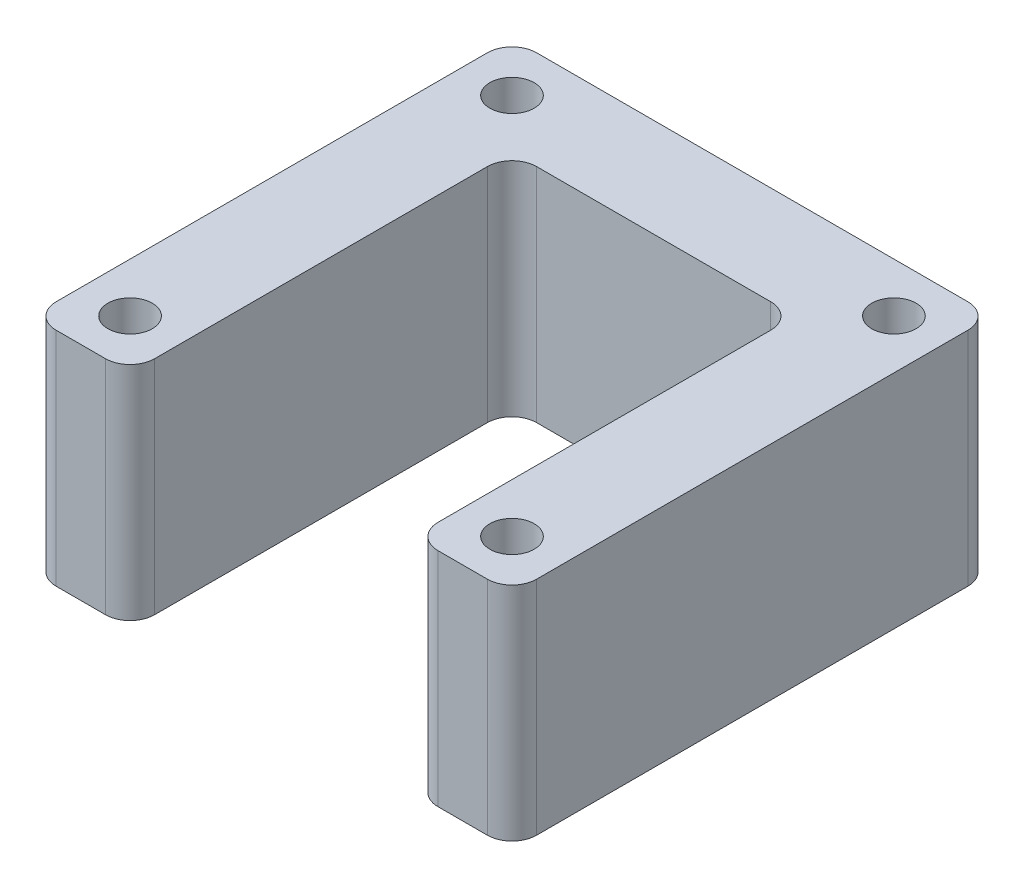
ISO-10303-21;
HEADER;
FILE_DESCRIPTION(('STEP AP214'),'2;1');
FILE_NAME('part.step','',(''),(''),'','','');
FILE_SCHEMA(('AUTOMOTIVE_DESIGN { 1 0 10303 214 1 1 1 1 }'));
ENDSEC;
DATA;
#1=APPLICATION_CONTEXT('core data for automotive mechanical design processes');
#2=APPLICATION_PROTOCOL_DEFINITION('international standard','automotive_design',2000,#1);
#3=PRODUCT_CONTEXT('',#1,'mechanical');
#4=PRODUCT('Part','Part','',(#3));
#5=PRODUCT_RELATED_PRODUCT_CATEGORY('part','',(#4));
#6=PRODUCT_DEFINITION_FORMATION('','',#4);
#7=PRODUCT_DEFINITION_CONTEXT('part definition',#1,'design');
#8=PRODUCT_DEFINITION('design','',#6,#7);
#9=PRODUCT_DEFINITION_SHAPE('','',#8);
#10=(LENGTH_UNIT() NAMED_UNIT(*) SI_UNIT(.MILLI.,.METRE.));
#11=(NAMED_UNIT(*) PLANE_ANGLE_UNIT() SI_UNIT($,.RADIAN.));
#12=(NAMED_UNIT(*) SI_UNIT($,.STERADIAN.) SOLID_ANGLE_UNIT());
#13=UNCERTAINTY_MEASURE_WITH_UNIT(LENGTH_MEASURE(1.E-05),#10,'distance_accuracy_value','');
#14=(GEOMETRIC_REPRESENTATION_CONTEXT(3) GLOBAL_UNCERTAINTY_ASSIGNED_CONTEXT((#13)) GLOBAL_UNIT_ASSIGNED_CONTEXT((#10,
#11,#12)) REPRESENTATION_CONTEXT('',''));
#15=CARTESIAN_POINT('',(0.,0.,0.));
#16=DIRECTION('',(0.,0.,1.));
#17=DIRECTION('',(1.,0.,0.));
#18=AXIS2_PLACEMENT_3D('',#15,#16,#17);
#19=CARTESIAN_POINT('',(-15.6073619631902,18.,0.));
#20=DIRECTION('',(1.,0.,0.));
#21=DIRECTION('',(0.,0.,-1.));
#22=AXIS2_PLACEMENT_3D('',#19,#20,#21);
#23=PLANE('',#22);
#24=DIRECTION('',(0.,0.,1.));
#25=VECTOR('',#24,1.);
#26=CARTESIAN_POINT('',(-15.6073619631902,18.,0.));
#27=LINE('',#26,#25);
#28=CARTESIAN_POINT('',(-15.6073619631902,18.,-21.2628834355828));
#29=VERTEX_POINT('',#28);
#30=CARTESIAN_POINT('',(-15.6073619631902,18.,13.7371165644172));
#31=VERTEX_POINT('',#30);
#32=EDGE_CURVE('E172',#29,#31,#27,.T.);
#33=ORIENTED_EDGE('',*,*,#32,.F.);
#34=DIRECTION('',(0.,-1.,0.));
#35=VECTOR('',#34,1.);
#36=CARTESIAN_POINT('',(-15.6073619631902,0.,-21.2628834355828));
#37=LINE('',#36,#35);
#38=CARTESIAN_POINT('',(-15.6073619631902,0.,-21.2628834355828));
#39=VERTEX_POINT('',#38);
#40=EDGE_CURVE('E157',#29,#39,#37,.T.);
#41=ORIENTED_EDGE('',*,*,#40,.T.);
#42=DIRECTION('',(0.,0.,1.));
#43=VECTOR('',#42,1.);
#44=CARTESIAN_POINT('',(-15.6073619631902,0.,0.));
#45=LINE('',#44,#43);
#46=CARTESIAN_POINT('',(-15.6073619631902,0.,13.7371165644172));
#47=VERTEX_POINT('',#46);
#48=EDGE_CURVE('E169',#39,#47,#45,.T.);
#49=ORIENTED_EDGE('',*,*,#48,.T.);
#50=DIRECTION('',(0.,-1.,0.));
#51=VECTOR('',#50,1.);
#52=CARTESIAN_POINT('',(-15.6073619631902,18.,13.7371165644172));
#53=LINE('',#52,#51);
#54=EDGE_CURVE('E174',#47,#31,#53,.F.);
#55=ORIENTED_EDGE('',*,*,#54,.T.);
#56=EDGE_LOOP('',(#33,#41,#49,#55));
#57=FACE_BOUND('',#56,.T.);
#58=ADVANCED_FACE('F39',(#57),#23,.F.);
#59=CARTESIAN_POINT('',(0.,18.,15.7371165644172));
#60=DIRECTION('',(0.,0.,-1.));
#61=DIRECTION('',(-1.,0.,0.));
#62=AXIS2_PLACEMENT_3D('',#59,#60,#61);
#63=PLANE('',#62);
#64=DIRECTION('',(1.,0.,0.));
#65=VECTOR('',#64,1.);
#66=CARTESIAN_POINT('',(0.,18.,15.7371165644172));
#67=LINE('',#66,#65);
#68=CARTESIAN_POINT('',(-13.6073619631902,18.,15.7371165644172));
#69=VERTEX_POINT('',#68);
#70=CARTESIAN_POINT('',(-9.60736196319018,18.,15.7371165644172));
#71=VERTEX_POINT('',#70);
#72=EDGE_CURVE('E371',#69,#71,#67,.T.);
#73=ORIENTED_EDGE('',*,*,#72,.F.);
#74=DIRECTION('',(0.,-1.,0.));
#75=VECTOR('',#74,1.);
#76=CARTESIAN_POINT('',(-13.6073619631902,18.,15.7371165644172));
#77=LINE('',#76,#75);
#78=CARTESIAN_POINT('',(-13.6073619631902,0.,15.7371165644172));
#79=VERTEX_POINT('',#78);
#80=EDGE_CURVE('E236',#69,#79,#77,.T.);
#81=ORIENTED_EDGE('',*,*,#80,.T.);
#82=DIRECTION('',(1.,0.,0.));
#83=VECTOR('',#82,1.);
#84=CARTESIAN_POINT('',(0.,0.,15.7371165644172));
#85=LINE('',#84,#83);
#86=CARTESIAN_POINT('',(-9.60736196319018,0.,15.7371165644172));
#87=VERTEX_POINT('',#86);
#88=EDGE_CURVE('E179',#79,#87,#85,.T.);
#89=ORIENTED_EDGE('',*,*,#88,.T.);
#90=DIRECTION('',(0.,-1.,0.));
#91=VECTOR('',#90,1.);
#92=CARTESIAN_POINT('',(-9.60736196319018,18.,15.7371165644172));
#93=LINE('',#92,#91);
#94=EDGE_CURVE('E234',#87,#71,#93,.F.);
#95=ORIENTED_EDGE('',*,*,#94,.T.);
#96=EDGE_LOOP('',(#73,#81,#89,#95));
#97=FACE_BOUND('',#96,.T.);
#98=ADVANCED_FACE('F324',(#97),#63,.F.);
#99=CARTESIAN_POINT('',(-7.60736196319018,18.,0.));
#100=DIRECTION('',(1.,0.,0.));
#101=DIRECTION('',(0.,0.,-1.));
#102=AXIS2_PLACEMENT_3D('',#99,#100,#101);
#103=PLANE('',#102);
#104=DIRECTION('',(0.,0.,1.));
#105=VECTOR('',#104,1.);
#106=CARTESIAN_POINT('',(-7.60736196319018,18.,0.));
#107=LINE('',#106,#105);
#108=CARTESIAN_POINT('',(-7.60736196319018,18.,-13.2628834355828));
#109=VERTEX_POINT('',#108);
#110=CARTESIAN_POINT('',(-7.60736196319018,18.,13.7371165644172));
#111=VERTEX_POINT('',#110);
#112=EDGE_CURVE('E289',#109,#111,#107,.T.);
#113=ORIENTED_EDGE('',*,*,#112,.T.);
#114=DIRECTION('',(0.,-1.,0.));
#115=VECTOR('',#114,1.);
#116=CARTESIAN_POINT('',(-7.60736196319018,0.,13.7371165644172));
#117=LINE('',#116,#115);
#118=CARTESIAN_POINT('',(-7.60736196319018,0.,13.7371165644172));
#119=VERTEX_POINT('',#118);
#120=EDGE_CURVE('E241',#111,#119,#117,.T.);
#121=ORIENTED_EDGE('',*,*,#120,.T.);
#122=DIRECTION('',(0.,0.,1.));
#123=VECTOR('',#122,1.);
#124=CARTESIAN_POINT('',(-7.60736196319018,0.,0.));
#125=LINE('',#124,#123);
#126=CARTESIAN_POINT('',(-7.60736196319018,0.,-13.2628834355828));
#127=VERTEX_POINT('',#126);
#128=EDGE_CURVE('E183',#127,#119,#125,.T.);
#129=ORIENTED_EDGE('',*,*,#128,.F.);
#130=DIRECTION('',(0.,-1.,0.));
#131=VECTOR('',#130,1.);
#132=CARTESIAN_POINT('',(-7.60736196319018,18.,-13.2628834355828));
#133=LINE('',#132,#131);
#134=EDGE_CURVE('E239',#127,#109,#133,.F.);
#135=ORIENTED_EDGE('',*,*,#134,.T.);
#136=EDGE_LOOP('',(#113,#121,#129,#135));
#137=FACE_BOUND('',#136,.T.);
#138=ADVANCED_FACE('F329',(#137),#103,.T.);
#139=CARTESIAN_POINT('',(0.,18.,-15.2628834355828));
#140=DIRECTION('',(0.,0.,1.));
#141=DIRECTION('',(1.,0.,0.));
#142=AXIS2_PLACEMENT_3D('',#139,#140,#141);
#143=PLANE('',#142);
#144=DIRECTION('',(-1.,0.,0.));
#145=VECTOR('',#144,1.);
#146=CARTESIAN_POINT('',(0.,18.,-15.2628834355828));
#147=LINE('',#146,#145);
#148=CARTESIAN_POINT('',(13.3926380368098,18.,-15.2628834355828));
#149=VERTEX_POINT('',#148);
#150=CARTESIAN_POINT('',(-5.60736196319018,18.,-15.2628834355828));
#151=VERTEX_POINT('',#150);
#152=EDGE_CURVE('E280',#149,#151,#147,.T.);
#153=ORIENTED_EDGE('',*,*,#152,.T.);
#154=DIRECTION('',(0.,-1.,0.));
#155=VECTOR('',#154,1.);
#156=CARTESIAN_POINT('',(-5.60736196319018,0.,-15.2628834355828));
#157=LINE('',#156,#155);
#158=CARTESIAN_POINT('',(-5.60736196319018,0.,-15.2628834355828));
#159=VERTEX_POINT('',#158);
#160=EDGE_CURVE('E246',#151,#159,#157,.T.);
#161=ORIENTED_EDGE('',*,*,#160,.T.);
#162=DIRECTION('',(-1.,0.,0.));
#163=VECTOR('',#162,1.);
#164=CARTESIAN_POINT('',(0.,0.,-15.2628834355828));
#165=LINE('',#164,#163);
#166=CARTESIAN_POINT('',(13.3926380368098,0.,-15.2628834355828));
#167=VERTEX_POINT('',#166);
#168=EDGE_CURVE('E192',#167,#159,#165,.T.);
#169=ORIENTED_EDGE('',*,*,#168,.F.);
#170=DIRECTION('',(0.,-1.,0.));
#171=VECTOR('',#170,1.);
#172=CARTESIAN_POINT('',(13.3926380368098,18.,-15.2628834355828));
#173=LINE('',#172,#171);
#174=EDGE_CURVE('E244',#167,#149,#173,.F.);
#175=ORIENTED_EDGE('',*,*,#174,.T.);
#176=EDGE_LOOP('',(#153,#161,#169,#175));
#177=FACE_BOUND('',#176,.T.);
#178=ADVANCED_FACE('F269',(#177),#143,.T.);
#179=CARTESIAN_POINT('',(15.3926380368098,18.,0.));
#180=DIRECTION('',(-1.,0.,0.));
#181=DIRECTION('',(0.,0.,1.));
#182=AXIS2_PLACEMENT_3D('',#179,#180,#181);
#183=PLANE('',#182);
#184=DIRECTION('',(0.,0.,-1.));
#185=VECTOR('',#184,1.);
#186=CARTESIAN_POINT('',(15.3926380368098,18.,0.));
#187=LINE('',#186,#185);
#188=CARTESIAN_POINT('',(15.3926380368098,18.,13.7371165644172));
#189=VERTEX_POINT('',#188);
#190=CARTESIAN_POINT('',(15.3926380368098,18.,-13.2628834355828));
#191=VERTEX_POINT('',#190);
#192=EDGE_CURVE('E278',#189,#191,#187,.T.);
#193=ORIENTED_EDGE('',*,*,#192,.T.);
#194=DIRECTION('',(0.,-1.,0.));
#195=VECTOR('',#194,1.);
#196=CARTESIAN_POINT('',(15.3926380368098,0.,-13.2628834355828));
#197=LINE('',#196,#195);
#198=CARTESIAN_POINT('',(15.3926380368098,0.,-13.2628834355828));
#199=VERTEX_POINT('',#198);
#200=EDGE_CURVE('E251',#191,#199,#197,.T.);
#201=ORIENTED_EDGE('',*,*,#200,.T.);
#202=DIRECTION('',(0.,0.,-1.));
#203=VECTOR('',#202,1.);
#204=CARTESIAN_POINT('',(15.3926380368098,0.,0.));
#205=LINE('',#204,#203);
#206=CARTESIAN_POINT('',(15.3926380368098,0.,13.7371165644172));
#207=VERTEX_POINT('',#206);
#208=EDGE_CURVE('E195',#207,#199,#205,.T.);
#209=ORIENTED_EDGE('',*,*,#208,.F.);
#210=DIRECTION('',(0.,-1.,0.));
#211=VECTOR('',#210,1.);
#212=CARTESIAN_POINT('',(15.3926380368098,18.,13.7371165644172));
#213=LINE('',#212,#211);
#214=EDGE_CURVE('E249',#207,#189,#213,.F.);
#215=ORIENTED_EDGE('',*,*,#214,.T.);
#216=EDGE_LOOP('',(#193,#201,#209,#215));
#217=FACE_BOUND('',#216,.T.);
#218=ADVANCED_FACE('F282',(#217),#183,.T.);
#219=CARTESIAN_POINT('',(0.,18.,15.7371165644172));
#220=DIRECTION('',(0.,0.,1.));
#221=DIRECTION('',(1.,0.,0.));
#222=AXIS2_PLACEMENT_3D('',#219,#220,#221);
#223=PLANE('',#222);
#224=DIRECTION('',(-1.,0.,0.));
#225=VECTOR('',#224,1.);
#226=CARTESIAN_POINT('',(0.,18.,15.7371165644172));
#227=LINE('',#226,#225);
#228=CARTESIAN_POINT('',(21.3926380368098,18.,15.7371165644172));
#229=VERTEX_POINT('',#228);
#230=CARTESIAN_POINT('',(17.3926380368098,18.,15.7371165644172));
#231=VERTEX_POINT('',#230);
#232=EDGE_CURVE('E284',#229,#231,#227,.T.);
#233=ORIENTED_EDGE('',*,*,#232,.T.);
#234=DIRECTION('',(0.,-1.,0.));
#235=VECTOR('',#234,1.);
#236=CARTESIAN_POINT('',(17.3926380368098,18.,15.7371165644172));
#237=LINE('',#236,#235);
#238=CARTESIAN_POINT('',(17.3926380368098,0.,15.7371165644172));
#239=VERTEX_POINT('',#238);
#240=EDGE_CURVE('E256',#231,#239,#237,.T.);
#241=ORIENTED_EDGE('',*,*,#240,.T.);
#242=DIRECTION('',(-1.,0.,0.));
#243=VECTOR('',#242,1.);
#244=CARTESIAN_POINT('',(0.,0.,15.7371165644172));
#245=LINE('',#244,#243);
#246=CARTESIAN_POINT('',(21.3926380368098,0.,15.7371165644172));
#247=VERTEX_POINT('',#246);
#248=EDGE_CURVE('E198',#247,#239,#245,.T.);
#249=ORIENTED_EDGE('',*,*,#248,.F.);
#250=DIRECTION('',(0.,-1.,0.));
#251=VECTOR('',#250,1.);
#252=CARTESIAN_POINT('',(21.3926380368098,18.,15.7371165644172));
#253=LINE('',#252,#251);
#254=EDGE_CURVE('E254',#247,#229,#253,.F.);
#255=ORIENTED_EDGE('',*,*,#254,.T.);
#256=EDGE_LOOP('',(#233,#241,#249,#255));
#257=FACE_BOUND('',#256,.T.);
#258=ADVANCED_FACE('F340',(#257),#223,.T.);
#259=CARTESIAN_POINT('',(23.3926380368098,18.,0.));
#260=DIRECTION('',(1.,0.,0.));
#261=DIRECTION('',(0.,0.,-1.));
#262=AXIS2_PLACEMENT_3D('',#259,#260,#261);
#263=PLANE('',#262);
#264=DIRECTION('',(0.,0.,1.));
#265=VECTOR('',#264,1.);
#266=CARTESIAN_POINT('',(23.3926380368098,0.,0.));
#267=LINE('',#266,#265);
#268=CARTESIAN_POINT('',(23.3926380368098,0.,-21.2628834355828));
#269=VERTEX_POINT('',#268);
#270=CARTESIAN_POINT('',(23.3926380368098,0.,13.7371165644172));
#271=VERTEX_POINT('',#270);
#272=EDGE_CURVE('E201',#269,#271,#267,.T.);
#273=ORIENTED_EDGE('',*,*,#272,.F.);
#274=DIRECTION('',(0.,-1.,0.));
#275=VECTOR('',#274,1.);
#276=CARTESIAN_POINT('',(23.3926380368098,18.,-21.2628834355828));
#277=LINE('',#276,#275);
#278=CARTESIAN_POINT('',(23.3926380368098,18.,-21.2628834355828));
#279=VERTEX_POINT('',#278);
#280=EDGE_CURVE('E61',#269,#279,#277,.F.);
#281=ORIENTED_EDGE('',*,*,#280,.T.);
#282=DIRECTION('',(0.,0.,1.));
#283=VECTOR('',#282,1.);
#284=CARTESIAN_POINT('',(23.3926380368098,18.,0.));
#285=LINE('',#284,#283);
#286=CARTESIAN_POINT('',(23.3926380368098,18.,13.7371165644172));
#287=VERTEX_POINT('',#286);
#288=EDGE_CURVE('E287',#279,#287,#285,.T.);
#289=ORIENTED_EDGE('',*,*,#288,.T.);
#290=DIRECTION('',(0.,-1.,0.));
#291=VECTOR('',#290,1.);
#292=CARTESIAN_POINT('',(23.3926380368098,18.,13.7371165644172));
#293=LINE('',#292,#291);
#294=EDGE_CURVE('E230',#287,#271,#293,.T.);
#295=ORIENTED_EDGE('',*,*,#294,.T.);
#296=EDGE_LOOP('',(#273,#281,#289,#295));
#297=FACE_BOUND('',#296,.T.);
#298=ADVANCED_FACE('F319',(#297),#263,.T.);
#299=CARTESIAN_POINT('',(-11.6073619631902,18.,-19.2628834355828));
#300=DIRECTION('',(0.,-1.,0.));
#301=DIRECTION('',(0.,0.,-1.));
#302=AXIS2_PLACEMENT_3D('',#299,#300,#301);
#303=CYLINDRICAL_SURFACE('',#302,1.8);
#304=CARTESIAN_POINT('',(-11.6073619631902,18.,-19.2628834355828));
#305=DIRECTION('',(0.,1.,0.));
#306=DIRECTION('',(0.,0.,1.));
#307=AXIS2_PLACEMENT_3D('',#304,#305,#306);
#308=CIRCLE('',#307,1.8);
#309=CARTESIAN_POINT('',(-11.6073619631902,18.,-17.4628834355828));
#310=VERTEX_POINT('',#309);
#311=EDGE_CURVE('E369',#310,#310,#308,.T.);
#312=ORIENTED_EDGE('',*,*,#311,.T.);
#313=EDGE_LOOP('',(#312));
#314=FACE_BOUND('',#313,.T.);
#315=CARTESIAN_POINT('',(-11.6073619631902,0.,-19.2628834355828));
#316=DIRECTION('',(0.,1.,0.));
#317=DIRECTION('',(0.,0.,1.));
#318=AXIS2_PLACEMENT_3D('',#315,#316,#317);
#319=CIRCLE('',#318,1.8);
#320=CARTESIAN_POINT('',(-11.6073619631902,0.,-17.4628834355828));
#321=VERTEX_POINT('',#320);
#322=EDGE_CURVE('E180',#321,#321,#319,.T.);
#323=ORIENTED_EDGE('',*,*,#322,.F.);
#324=EDGE_LOOP('',(#323));
#325=FACE_BOUND('',#324,.T.);
#326=ADVANCED_FACE('F309',(#314,#325),#303,.F.);
#327=CARTESIAN_POINT('',(19.3926380368098,18.,-19.2628834355828));
#328=DIRECTION('',(0.,-1.,0.));
#329=DIRECTION('',(0.,0.,-1.));
#330=AXIS2_PLACEMENT_3D('',#327,#328,#329);
#331=CYLINDRICAL_SURFACE('',#330,1.8);
#332=CARTESIAN_POINT('',(19.3926380368098,18.,-19.2628834355828));
#333=DIRECTION('',(0.,1.,0.));
#334=DIRECTION('',(0.,0.,1.));
#335=AXIS2_PLACEMENT_3D('',#332,#333,#334);
#336=CIRCLE('',#335,1.8);
#337=CARTESIAN_POINT('',(19.3926380368098,18.,-17.4628834355828));
#338=VERTEX_POINT('',#337);
#339=EDGE_CURVE('E366',#338,#338,#336,.T.);
#340=ORIENTED_EDGE('',*,*,#339,.T.);
#341=EDGE_LOOP('',(#340));
#342=FACE_BOUND('',#341,.T.);
#343=CARTESIAN_POINT('',(19.3926380368098,0.,-19.2628834355828));
#344=DIRECTION('',(0.,1.,0.));
#345=DIRECTION('',(0.,0.,1.));
#346=AXIS2_PLACEMENT_3D('',#343,#344,#345);
#347=CIRCLE('',#346,1.8);
#348=CARTESIAN_POINT('',(19.3926380368098,0.,-17.4628834355828));
#349=VERTEX_POINT('',#348);
#350=EDGE_CURVE('E186',#349,#349,#347,.T.);
#351=ORIENTED_EDGE('',*,*,#350,.F.);
#352=EDGE_LOOP('',(#351));
#353=FACE_BOUND('',#352,.T.);
#354=ADVANCED_FACE('F306',(#342,#353),#331,.F.);
#355=CARTESIAN_POINT('',(19.3926380368098,18.,11.7371165644172));
#356=DIRECTION('',(0.,-1.,0.));
#357=DIRECTION('',(0.,0.,-1.));
#358=AXIS2_PLACEMENT_3D('',#355,#356,#357);
#359=CYLINDRICAL_SURFACE('',#358,1.8);
#360=CARTESIAN_POINT('',(19.3926380368098,18.,11.7371165644172));
#361=DIRECTION('',(0.,1.,0.));
#362=DIRECTION('',(0.,0.,1.));
#363=AXIS2_PLACEMENT_3D('',#360,#361,#362);
#364=CIRCLE('',#363,1.8);
#365=CARTESIAN_POINT('',(19.3926380368098,18.,13.5371165644172));
#366=VERTEX_POINT('',#365);
#367=EDGE_CURVE('E363',#366,#366,#364,.T.);
#368=ORIENTED_EDGE('',*,*,#367,.T.);
#369=EDGE_LOOP('',(#368));
#370=FACE_BOUND('',#369,.T.);
#371=CARTESIAN_POINT('',(19.3926380368098,0.,11.7371165644172));
#372=DIRECTION('',(0.,1.,0.));
#373=DIRECTION('',(0.,0.,1.));
#374=AXIS2_PLACEMENT_3D('',#371,#372,#373);
#375=CIRCLE('',#374,1.8);
#376=CARTESIAN_POINT('',(19.3926380368098,0.,13.5371165644172));
#377=VERTEX_POINT('',#376);
#378=EDGE_CURVE('E299',#377,#377,#375,.T.);
#379=ORIENTED_EDGE('',*,*,#378,.F.);
#380=EDGE_LOOP('',(#379));
#381=FACE_BOUND('',#380,.T.);
#382=ADVANCED_FACE('F308',(#370,#381),#359,.F.);
#383=CARTESIAN_POINT('',(-11.6073619631902,18.,11.7371165644172));
#384=DIRECTION('',(0.,-1.,0.));
#385=DIRECTION('',(0.,0.,-1.));
#386=AXIS2_PLACEMENT_3D('',#383,#384,#385);
#387=CYLINDRICAL_SURFACE('',#386,1.8);
#388=CARTESIAN_POINT('',(-11.6073619631902,18.,11.7371165644172));
#389=DIRECTION('',(0.,1.,0.));
#390=DIRECTION('',(0.,0.,1.));
#391=AXIS2_PLACEMENT_3D('',#388,#389,#390);
#392=CIRCLE('',#391,1.8);
#393=CARTESIAN_POINT('',(-11.6073619631902,18.,13.5371165644172));
#394=VERTEX_POINT('',#393);
#395=EDGE_CURVE('E206',#394,#394,#392,.T.);
#396=ORIENTED_EDGE('',*,*,#395,.T.);
#397=EDGE_LOOP('',(#396));
#398=FACE_BOUND('',#397,.T.);
#399=CARTESIAN_POINT('',(-11.6073619631902,0.,11.7371165644172));
#400=DIRECTION('',(0.,1.,0.));
#401=DIRECTION('',(0.,0.,1.));
#402=AXIS2_PLACEMENT_3D('',#399,#400,#401);
#403=CIRCLE('',#402,1.8);
#404=CARTESIAN_POINT('',(-11.6073619631902,0.,13.5371165644172));
#405=VERTEX_POINT('',#404);
#406=EDGE_CURVE('E296',#405,#405,#403,.T.);
#407=ORIENTED_EDGE('',*,*,#406,.F.);
#408=EDGE_LOOP('',(#407));
#409=FACE_BOUND('',#408,.T.);
#410=ADVANCED_FACE('F316',(#398,#409),#387,.F.);
#411=CARTESIAN_POINT('',(0.,18.,-23.2628834355828));
#412=DIRECTION('',(0.,0.,-1.));
#413=DIRECTION('',(-1.,0.,0.));
#414=AXIS2_PLACEMENT_3D('',#411,#412,#413);
#415=PLANE('',#414);
#416=DIRECTION('',(1.,0.,0.));
#417=VECTOR('',#416,1.);
#418=CARTESIAN_POINT('',(0.,0.,-23.2628834355828));
#419=LINE('',#418,#417);
#420=CARTESIAN_POINT('',(-13.6073619631902,0.,-23.2628834355828));
#421=VERTEX_POINT('',#420);
#422=CARTESIAN_POINT('',(21.3926380368098,0.,-23.2628834355828));
#423=VERTEX_POINT('',#422);
#424=EDGE_CURVE('E204',#421,#423,#419,.T.);
#425=ORIENTED_EDGE('',*,*,#424,.F.);
#426=DIRECTION('',(0.,-1.,0.));
#427=VECTOR('',#426,1.);
#428=CARTESIAN_POINT('',(-13.6073619631902,18.,-23.2628834355828));
#429=LINE('',#428,#427);
#430=CARTESIAN_POINT('',(-13.6073619631902,18.,-23.2628834355828));
#431=VERTEX_POINT('',#430);
#432=EDGE_CURVE('E158',#421,#431,#429,.F.);
#433=ORIENTED_EDGE('',*,*,#432,.T.);
#434=DIRECTION('',(1.,0.,0.));
#435=VECTOR('',#434,1.);
#436=CARTESIAN_POINT('',(0.,18.,-23.2628834355828));
#437=LINE('',#436,#435);
#438=CARTESIAN_POINT('',(21.3926380368098,18.,-23.2628834355828));
#439=VERTEX_POINT('',#438);
#440=EDGE_CURVE('E207',#431,#439,#437,.T.);
#441=ORIENTED_EDGE('',*,*,#440,.T.);
#442=DIRECTION('',(0.,-1.,0.));
#443=VECTOR('',#442,1.);
#444=CARTESIAN_POINT('',(21.3926380368098,18.,-23.2628834355828));
#445=LINE('',#444,#443);
#446=EDGE_CURVE('E163',#439,#423,#445,.T.);
#447=ORIENTED_EDGE('',*,*,#446,.T.);
#448=EDGE_LOOP('',(#425,#433,#441,#447));
#449=FACE_BOUND('',#448,.T.);
#450=ADVANCED_FACE('F346',(#449),#415,.T.);
#451=CARTESIAN_POINT('',(0.,18.,0.));
#452=DIRECTION('',(0.,1.,0.));
#453=DIRECTION('',(0.,0.,1.));
#454=AXIS2_PLACEMENT_3D('',#451,#452,#453);
#455=PLANE('',#454);
#456=ORIENTED_EDGE('',*,*,#395,.F.);
#457=EDGE_LOOP('',(#456));
#458=FACE_BOUND('',#457,.T.);
#459=ORIENTED_EDGE('',*,*,#367,.F.);
#460=EDGE_LOOP('',(#459));
#461=FACE_BOUND('',#460,.T.);
#462=ORIENTED_EDGE('',*,*,#339,.F.);
#463=EDGE_LOOP('',(#462));
#464=FACE_BOUND('',#463,.T.);
#465=ORIENTED_EDGE('',*,*,#311,.F.);
#466=EDGE_LOOP('',(#465));
#467=FACE_BOUND('',#466,.T.);
#468=ORIENTED_EDGE('',*,*,#440,.F.);
#469=CARTESIAN_POINT('',(-13.6073619631902,18.,-21.2628834355828));
#470=DIRECTION('',(0.,1.,0.));
#471=DIRECTION('',(0.,0.,1.));
#472=AXIS2_PLACEMENT_3D('',#469,#470,#471);
#473=CIRCLE('',#472,2.);
#474=EDGE_CURVE('E228',#431,#29,#473,.T.);
#475=ORIENTED_EDGE('',*,*,#474,.T.);
#476=ORIENTED_EDGE('',*,*,#32,.T.);
#477=CARTESIAN_POINT('',(-13.6073619631902,18.,13.7371165644172));
#478=DIRECTION('',(0.,1.,0.));
#479=DIRECTION('',(0.,0.,1.));
#480=AXIS2_PLACEMENT_3D('',#477,#478,#479);
#481=CIRCLE('',#480,2.);
#482=EDGE_CURVE('E224',#31,#69,#481,.T.);
#483=ORIENTED_EDGE('',*,*,#482,.T.);
#484=ORIENTED_EDGE('',*,*,#72,.T.);
#485=CARTESIAN_POINT('',(-9.60736196319018,18.,13.7371165644172));
#486=DIRECTION('',(0.,1.,0.));
#487=DIRECTION('',(0.,0.,1.));
#488=AXIS2_PLACEMENT_3D('',#485,#486,#487);
#489=CIRCLE('',#488,2.);
#490=EDGE_CURVE('E222',#71,#111,#489,.T.);
#491=ORIENTED_EDGE('',*,*,#490,.T.);
#492=ORIENTED_EDGE('',*,*,#112,.F.);
#493=CARTESIAN_POINT('',(-5.60736196319018,18.,-13.2628834355828));
#494=DIRECTION('',(0.,1.,0.));
#495=DIRECTION('',(0.,0.,1.));
#496=AXIS2_PLACEMENT_3D('',#493,#494,#495);
#497=CIRCLE('',#496,2.);
#498=EDGE_CURVE('E261',#109,#151,#497,.F.);
#499=ORIENTED_EDGE('',*,*,#498,.T.);
#500=ORIENTED_EDGE('',*,*,#152,.F.);
#501=CARTESIAN_POINT('',(13.3926380368098,18.,-13.2628834355828));
#502=DIRECTION('',(0.,1.,0.));
#503=DIRECTION('',(0.,0.,1.));
#504=AXIS2_PLACEMENT_3D('',#501,#502,#503);
#505=CIRCLE('',#504,2.);
#506=EDGE_CURVE('E11',#149,#191,#505,.F.);
#507=ORIENTED_EDGE('',*,*,#506,.T.);
#508=ORIENTED_EDGE('',*,*,#192,.F.);
#509=CARTESIAN_POINT('',(17.3926380368098,18.,13.7371165644172));
#510=DIRECTION('',(0.,1.,0.));
#511=DIRECTION('',(0.,0.,1.));
#512=AXIS2_PLACEMENT_3D('',#509,#510,#511);
#513=CIRCLE('',#512,2.);
#514=EDGE_CURVE('E220',#189,#231,#513,.T.);
#515=ORIENTED_EDGE('',*,*,#514,.T.);
#516=ORIENTED_EDGE('',*,*,#232,.F.);
#517=CARTESIAN_POINT('',(21.3926380368098,18.,13.7371165644172));
#518=DIRECTION('',(0.,1.,0.));
#519=DIRECTION('',(0.,0.,1.));
#520=AXIS2_PLACEMENT_3D('',#517,#518,#519);
#521=CIRCLE('',#520,2.);
#522=EDGE_CURVE('E54',#229,#287,#521,.T.);
#523=ORIENTED_EDGE('',*,*,#522,.T.);
#524=ORIENTED_EDGE('',*,*,#288,.F.);
#525=CARTESIAN_POINT('',(21.3926380368098,18.,-21.2628834355828));
#526=DIRECTION('',(0.,1.,0.));
#527=DIRECTION('',(0.,0.,1.));
#528=AXIS2_PLACEMENT_3D('',#525,#526,#527);
#529=CIRCLE('',#528,2.);
#530=EDGE_CURVE('E226',#279,#439,#529,.T.);
#531=ORIENTED_EDGE('',*,*,#530,.T.);
#532=EDGE_LOOP('',(#468,#475,#476,#483,#484,#491,#492,#499,#500,#507,#508,#515,#516,#523,#524,#531));
#533=FACE_BOUND('',#532,.T.);
#534=ADVANCED_FACE('F277',(#458,#461,#464,#467,#533),#455,.T.);
#535=CARTESIAN_POINT('',(0.,0.,0.));
#536=DIRECTION('',(0.,1.,0.));
#537=DIRECTION('',(0.,0.,1.));
#538=AXIS2_PLACEMENT_3D('',#535,#536,#537);
#539=PLANE('',#538);
#540=ORIENTED_EDGE('',*,*,#406,.T.);
#541=EDGE_LOOP('',(#540));
#542=FACE_BOUND('',#541,.T.);
#543=ORIENTED_EDGE('',*,*,#378,.T.);
#544=EDGE_LOOP('',(#543));
#545=FACE_BOUND('',#544,.T.);
#546=ORIENTED_EDGE('',*,*,#350,.T.);
#547=EDGE_LOOP('',(#546));
#548=FACE_BOUND('',#547,.T.);
#549=ORIENTED_EDGE('',*,*,#322,.T.);
#550=EDGE_LOOP('',(#549));
#551=FACE_BOUND('',#550,.T.);
#552=ORIENTED_EDGE('',*,*,#48,.F.);
#553=CARTESIAN_POINT('',(-13.6073619631902,0.,-21.2628834355828));
#554=DIRECTION('',(0.,1.,0.));
#555=DIRECTION('',(0.,0.,1.));
#556=AXIS2_PLACEMENT_3D('',#553,#554,#555);
#557=CIRCLE('',#556,2.);
#558=EDGE_CURVE('E153',#39,#421,#557,.F.);
#559=ORIENTED_EDGE('',*,*,#558,.T.);
#560=ORIENTED_EDGE('',*,*,#424,.T.);
#561=CARTESIAN_POINT('',(21.3926380368098,0.,-21.2628834355828));
#562=DIRECTION('',(0.,1.,0.));
#563=DIRECTION('',(0.,0.,1.));
#564=AXIS2_PLACEMENT_3D('',#561,#562,#563);
#565=CIRCLE('',#564,2.);
#566=EDGE_CURVE('E164',#423,#269,#565,.F.);
#567=ORIENTED_EDGE('',*,*,#566,.T.);
#568=ORIENTED_EDGE('',*,*,#272,.T.);
#569=CARTESIAN_POINT('',(21.3926380368098,0.,13.7371165644172));
#570=DIRECTION('',(0.,1.,0.));
#571=DIRECTION('',(0.,0.,1.));
#572=AXIS2_PLACEMENT_3D('',#569,#570,#571);
#573=CIRCLE('',#572,2.);
#574=EDGE_CURVE('E173',#271,#247,#573,.F.);
#575=ORIENTED_EDGE('',*,*,#574,.T.);
#576=ORIENTED_EDGE('',*,*,#248,.T.);
#577=CARTESIAN_POINT('',(17.3926380368098,0.,13.7371165644172));
#578=DIRECTION('',(0.,1.,0.));
#579=DIRECTION('',(0.,0.,1.));
#580=AXIS2_PLACEMENT_3D('',#577,#578,#579);
#581=CIRCLE('',#580,2.);
#582=EDGE_CURVE('E210',#239,#207,#581,.F.);
#583=ORIENTED_EDGE('',*,*,#582,.T.);
#584=ORIENTED_EDGE('',*,*,#208,.T.);
#585=CARTESIAN_POINT('',(13.3926380368098,0.,-13.2628834355828));
#586=DIRECTION('',(0.,1.,0.));
#587=DIRECTION('',(0.,0.,1.));
#588=AXIS2_PLACEMENT_3D('',#585,#586,#587);
#589=CIRCLE('',#588,2.);
#590=EDGE_CURVE('E47',#199,#167,#589,.T.);
#591=ORIENTED_EDGE('',*,*,#590,.T.);
#592=ORIENTED_EDGE('',*,*,#168,.T.);
#593=CARTESIAN_POINT('',(-5.60736196319018,0.,-13.2628834355828));
#594=DIRECTION('',(0.,1.,0.));
#595=DIRECTION('',(0.,0.,1.));
#596=AXIS2_PLACEMENT_3D('',#593,#594,#595);
#597=CIRCLE('',#596,2.);
#598=EDGE_CURVE('E259',#159,#127,#597,.T.);
#599=ORIENTED_EDGE('',*,*,#598,.T.);
#600=ORIENTED_EDGE('',*,*,#128,.T.);
#601=CARTESIAN_POINT('',(-9.60736196319018,0.,13.7371165644172));
#602=DIRECTION('',(0.,1.,0.));
#603=DIRECTION('',(0.,0.,1.));
#604=AXIS2_PLACEMENT_3D('',#601,#602,#603);
#605=CIRCLE('',#604,2.);
#606=EDGE_CURVE('E212',#119,#87,#605,.F.);
#607=ORIENTED_EDGE('',*,*,#606,.T.);
#608=ORIENTED_EDGE('',*,*,#88,.F.);
#609=CARTESIAN_POINT('',(-13.6073619631902,0.,13.7371165644172));
#610=DIRECTION('',(0.,1.,0.));
#611=DIRECTION('',(0.,0.,1.));
#612=AXIS2_PLACEMENT_3D('',#609,#610,#611);
#613=CIRCLE('',#612,2.);
#614=EDGE_CURVE('E178',#79,#47,#613,.F.);
#615=ORIENTED_EDGE('',*,*,#614,.T.);
#616=EDGE_LOOP('',(#552,#559,#560,#567,#568,#575,#576,#583,#584,#591,#592,#599,#600,#607,#608,#615));
#617=FACE_BOUND('',#616,.T.);
#618=ADVANCED_FACE('F176',(#542,#545,#548,#551,#617),#539,.F.);
#619=CARTESIAN_POINT('',(-13.6073619631902,18.,-21.2628834355828));
#620=DIRECTION('',(0.,1.,0.));
#621=DIRECTION('',(0.,0.,1.));
#622=AXIS2_PLACEMENT_3D('',#619,#620,#621);
#623=CYLINDRICAL_SURFACE('',#622,2.);
#624=ORIENTED_EDGE('',*,*,#474,.F.);
#625=ORIENTED_EDGE('',*,*,#432,.F.);
#626=ORIENTED_EDGE('',*,*,#558,.F.);
#627=ORIENTED_EDGE('',*,*,#40,.F.);
#628=EDGE_LOOP('',(#624,#625,#626,#627));
#629=FACE_BOUND('',#628,.T.);
#630=ADVANCED_FACE('F156',(#629),#623,.T.);
#631=CARTESIAN_POINT('',(21.3926380368098,18.,-21.2628834355828));
#632=DIRECTION('',(0.,-1.,0.));
#633=DIRECTION('',(0.,0.,-1.));
#634=AXIS2_PLACEMENT_3D('',#631,#632,#633);
#635=CYLINDRICAL_SURFACE('',#634,2.);
#636=ORIENTED_EDGE('',*,*,#530,.F.);
#637=ORIENTED_EDGE('',*,*,#280,.F.);
#638=ORIENTED_EDGE('',*,*,#566,.F.);
#639=ORIENTED_EDGE('',*,*,#446,.F.);
#640=EDGE_LOOP('',(#636,#637,#638,#639));
#641=FACE_BOUND('',#640,.T.);
#642=ADVANCED_FACE('F395',(#641),#635,.T.);
#643=CARTESIAN_POINT('',(-13.6073619631902,18.,13.7371165644172));
#644=DIRECTION('',(0.,-1.,0.));
#645=DIRECTION('',(0.,0.,-1.));
#646=AXIS2_PLACEMENT_3D('',#643,#644,#645);
#647=CYLINDRICAL_SURFACE('',#646,2.);
#648=ORIENTED_EDGE('',*,*,#482,.F.);
#649=ORIENTED_EDGE('',*,*,#54,.F.);
#650=ORIENTED_EDGE('',*,*,#614,.F.);
#651=ORIENTED_EDGE('',*,*,#80,.F.);
#652=EDGE_LOOP('',(#648,#649,#650,#651));
#653=FACE_BOUND('',#652,.T.);
#654=ADVANCED_FACE('F391',(#653),#647,.T.);
#655=CARTESIAN_POINT('',(-9.60736196319018,18.,13.7371165644172));
#656=DIRECTION('',(0.,1.,0.));
#657=DIRECTION('',(0.,0.,1.));
#658=AXIS2_PLACEMENT_3D('',#655,#656,#657);
#659=CYLINDRICAL_SURFACE('',#658,2.);
#660=ORIENTED_EDGE('',*,*,#490,.F.);
#661=ORIENTED_EDGE('',*,*,#94,.F.);
#662=ORIENTED_EDGE('',*,*,#606,.F.);
#663=ORIENTED_EDGE('',*,*,#120,.F.);
#664=EDGE_LOOP('',(#660,#661,#662,#663));
#665=FACE_BOUND('',#664,.T.);
#666=ADVANCED_FACE('F385',(#665),#659,.T.);
#667=CARTESIAN_POINT('',(-5.60736196319018,18.,-13.2628834355828));
#668=DIRECTION('',(0.,1.,0.));
#669=DIRECTION('',(0.,0.,1.));
#670=AXIS2_PLACEMENT_3D('',#667,#668,#669);
#671=CYLINDRICAL_SURFACE('',#670,2.);
#672=ORIENTED_EDGE('',*,*,#498,.F.);
#673=ORIENTED_EDGE('',*,*,#134,.F.);
#674=ORIENTED_EDGE('',*,*,#598,.F.);
#675=ORIENTED_EDGE('',*,*,#160,.F.);
#676=EDGE_LOOP('',(#672,#673,#674,#675));
#677=FACE_BOUND('',#676,.T.);
#678=ADVANCED_FACE('F408',(#677),#671,.F.);
#679=CARTESIAN_POINT('',(13.3926380368098,18.,-13.2628834355828));
#680=DIRECTION('',(0.,1.,0.));
#681=DIRECTION('',(0.,0.,1.));
#682=AXIS2_PLACEMENT_3D('',#679,#680,#681);
#683=CYLINDRICAL_SURFACE('',#682,2.);
#684=ORIENTED_EDGE('',*,*,#506,.F.);
#685=ORIENTED_EDGE('',*,*,#174,.F.);
#686=ORIENTED_EDGE('',*,*,#590,.F.);
#687=ORIENTED_EDGE('',*,*,#200,.F.);
#688=EDGE_LOOP('',(#684,#685,#686,#687));
#689=FACE_BOUND('',#688,.T.);
#690=ADVANCED_FACE('F273',(#689),#683,.F.);
#691=CARTESIAN_POINT('',(17.3926380368098,18.,13.7371165644172));
#692=DIRECTION('',(0.,-1.,0.));
#693=DIRECTION('',(0.,0.,-1.));
#694=AXIS2_PLACEMENT_3D('',#691,#692,#693);
#695=CYLINDRICAL_SURFACE('',#694,2.);
#696=ORIENTED_EDGE('',*,*,#514,.F.);
#697=ORIENTED_EDGE('',*,*,#214,.F.);
#698=ORIENTED_EDGE('',*,*,#582,.F.);
#699=ORIENTED_EDGE('',*,*,#240,.F.);
#700=EDGE_LOOP('',(#696,#697,#698,#699));
#701=FACE_BOUND('',#700,.T.);
#702=ADVANCED_FACE('F402',(#701),#695,.T.);
#703=CARTESIAN_POINT('',(21.3926380368098,18.,13.7371165644172));
#704=DIRECTION('',(0.,-1.,0.));
#705=DIRECTION('',(0.,0.,-1.));
#706=AXIS2_PLACEMENT_3D('',#703,#704,#705);
#707=CYLINDRICAL_SURFACE('',#706,2.);
#708=ORIENTED_EDGE('',*,*,#522,.F.);
#709=ORIENTED_EDGE('',*,*,#254,.F.);
#710=ORIENTED_EDGE('',*,*,#574,.F.);
#711=ORIENTED_EDGE('',*,*,#294,.F.);
#712=EDGE_LOOP('',(#708,#709,#710,#711));
#713=FACE_BOUND('',#712,.T.);
#714=ADVANCED_FACE('F41',(#713),#707,.T.);
#715=CLOSED_SHELL('',(#58,#98,#138,#178,#218,#258,#298,#326,#354,#382,#410,#450,#534,#618,#630,
#642,#654,#666,#678,#690,#702,#714));
#716=MANIFOLD_SOLID_BREP('B2',#715);
#717=ADVANCED_BREP_SHAPE_REPRESENTATION('',(#18,#716),#14);
#718=SHAPE_DEFINITION_REPRESENTATION(#9,#717);
ENDSEC;
END-ISO-10303-21;
